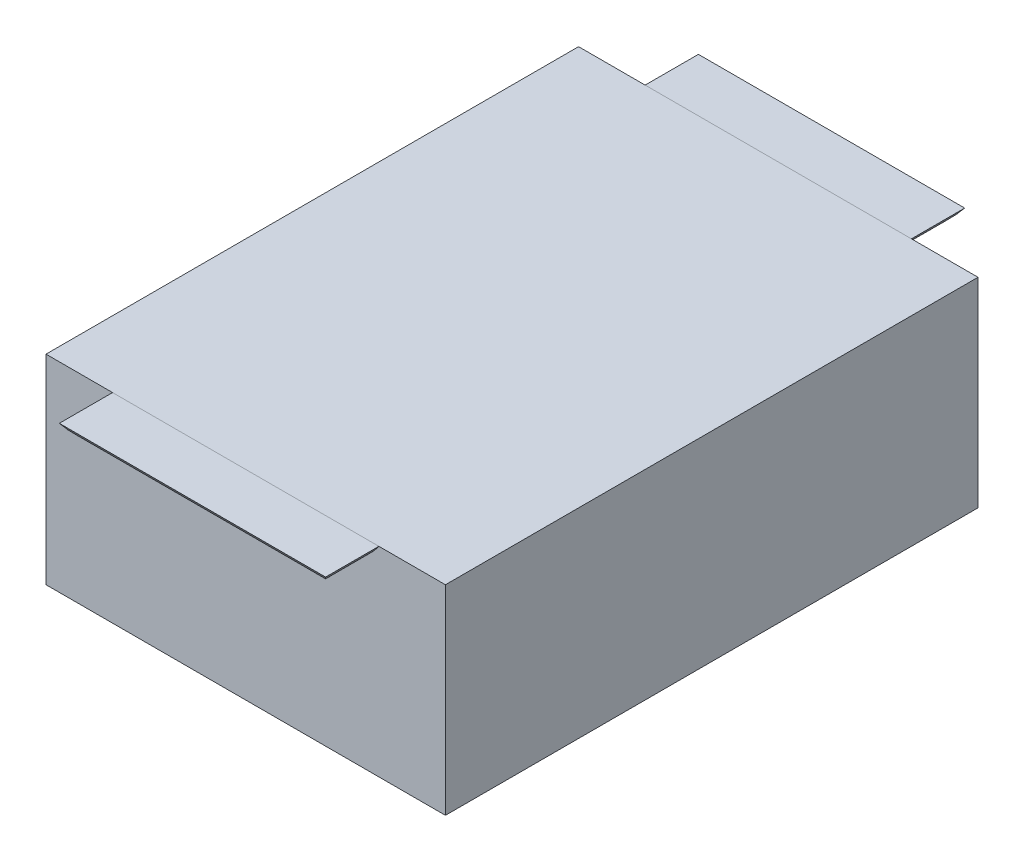
ISO-10303-21;
HEADER;
FILE_DESCRIPTION(('STEP AP214'),'2;1');
FILE_NAME('part.step','',(''),(''),'','','');
FILE_SCHEMA(('AUTOMOTIVE_DESIGN { 1 0 10303 214 1 1 1 1 }'));
ENDSEC;
DATA;
#1=APPLICATION_CONTEXT('core data for automotive mechanical design processes');
#2=APPLICATION_PROTOCOL_DEFINITION('international standard','automotive_design',2000,#1);
#3=PRODUCT_CONTEXT('',#1,'mechanical');
#4=PRODUCT('Part','Part','',(#3));
#5=PRODUCT_RELATED_PRODUCT_CATEGORY('part','',(#4));
#6=PRODUCT_DEFINITION_FORMATION('','',#4);
#7=PRODUCT_DEFINITION_CONTEXT('part definition',#1,'design');
#8=PRODUCT_DEFINITION('design','',#6,#7);
#9=PRODUCT_DEFINITION_SHAPE('','',#8);
#10=(LENGTH_UNIT() NAMED_UNIT(*) SI_UNIT(.MILLI.,.METRE.));
#11=(NAMED_UNIT(*) PLANE_ANGLE_UNIT() SI_UNIT($,.RADIAN.));
#12=(NAMED_UNIT(*) SI_UNIT($,.STERADIAN.) SOLID_ANGLE_UNIT());
#13=UNCERTAINTY_MEASURE_WITH_UNIT(LENGTH_MEASURE(1.E-05),#10,'distance_accuracy_value','');
#14=(GEOMETRIC_REPRESENTATION_CONTEXT(3) GLOBAL_UNCERTAINTY_ASSIGNED_CONTEXT((#13)) GLOBAL_UNIT_ASSIGNED_CONTEXT((#10,
#11,#12)) REPRESENTATION_CONTEXT('',''));
#15=CARTESIAN_POINT('',(0.,0.,0.));
#16=DIRECTION('',(0.,0.,1.));
#17=DIRECTION('',(1.,0.,0.));
#18=AXIS2_PLACEMENT_3D('',#15,#16,#17);
#19=CARTESIAN_POINT('',(21.85,0.,1.26033599464366));
#20=DIRECTION('',(0.,-1.,0.));
#21=DIRECTION('',(0.,0.,-1.));
#22=AXIS2_PLACEMENT_3D('',#19,#20,#21);
#23=PLANE('',#22);
#24=CARTESIAN_POINT('',(17.4533707275771,0.,-13.3793280107127));
#25=DIRECTION('',(0.,-1.,0.));
#26=DIRECTION('',(0.,0.,-1.));
#27=AXIS2_PLACEMENT_3D('',#24,#25,#26);
#28=CIRCLE('',#27,0.900000000000001);
#29=CARTESIAN_POINT('',(17.4533707275771,0.,-14.2793280107127));
#30=VERTEX_POINT('',#29);
#31=EDGE_CURVE('P0_E17',#30,#30,#28,.T.);
#32=ORIENTED_EDGE('',*,*,#31,.F.);
#33=EDGE_LOOP('',(#32));
#34=FACE_BOUND('',#33,.T.);
#35=ADVANCED_FACE('P0_F14',(#34),#23,.F.);
#36=CARTESIAN_POINT('',(17.4533707275771,0.,-13.3793280107127));
#37=DIRECTION('',(0.,-1.,0.));
#38=DIRECTION('',(0.,0.,-1.));
#39=AXIS2_PLACEMENT_3D('',#36,#37,#38);
#40=CYLINDRICAL_SURFACE('',#39,0.900000000000001);
#41=ORIENTED_EDGE('',*,*,#31,.T.);
#42=EDGE_LOOP('',(#41));
#43=FACE_BOUND('',#42,.T.);
#44=CARTESIAN_POINT('',(17.4533707275771,-0.2,-13.3793280107127));
#45=DIRECTION('',(0.,-1.,0.));
#46=DIRECTION('',(0.,0.,-1.));
#47=AXIS2_PLACEMENT_3D('',#44,#45,#46);
#48=CIRCLE('',#47,0.900000000000001);
#49=CARTESIAN_POINT('',(17.4533707275771,-0.2,-14.2793280107127));
#50=VERTEX_POINT('',#49);
#51=EDGE_CURVE('P0_E10',#50,#50,#48,.T.);
#52=ORIENTED_EDGE('',*,*,#51,.F.);
#53=EDGE_LOOP('',(#52));
#54=FACE_BOUND('',#53,.T.);
#55=ADVANCED_FACE('P0_F26',(#43,#54),#40,.T.);
#56=CARTESIAN_POINT('',(21.85,-0.2,1.26033599464366));
#57=DIRECTION('',(0.,-1.,0.));
#58=DIRECTION('',(0.,0.,-1.));
#59=AXIS2_PLACEMENT_3D('',#56,#57,#58);
#60=PLANE('',#59);
#61=ORIENTED_EDGE('',*,*,#51,.T.);
#62=EDGE_LOOP('',(#61));
#63=FACE_BOUND('',#62,.T.);
#64=ADVANCED_FACE('P0_F34',(#63),#60,.T.);
#65=CLOSED_SHELL('',(#35,#55,#64));
#66=MANIFOLD_SOLID_BREP('P0_B1',#65);
#67=CARTESIAN_POINT('',(17.4533707275771,1.3,-13.1793280107127));
#68=DIRECTION('',(0.,1.,0.));
#69=DIRECTION('',(0.,0.,1.));
#70=AXIS2_PLACEMENT_3D('',#67,#68,#69);
#71=PLANE('',#70);
#72=DIRECTION('',(-1.,0.,0.));
#73=VECTOR('',#72,1.);
#74=CARTESIAN_POINT('',(16.4533707275771,1.3,-11.3793280107127));
#75=LINE('',#74,#73);
#76=CARTESIAN_POINT('',(18.0792049888997,1.3,-11.3793280107127));
#77=VERTEX_POINT('',#76);
#78=CARTESIAN_POINT('',(16.8275364662545,1.3,-11.3793280107127));
#79=VERTEX_POINT('',#78);
#80=EDGE_CURVE('P1_E62',#77,#79,#75,.T.);
#81=ORIENTED_EDGE('',*,*,#80,.F.);
#82=DIRECTION('',(0.,0.,-1.));
#83=VECTOR('',#82,1.);
#84=CARTESIAN_POINT('',(18.0792049888997,1.3,-10.9793280107127));
#85=LINE('',#84,#83);
#86=CARTESIAN_POINT('',(18.0792049888997,1.3,-11.3534937493901));
#87=VERTEX_POINT('',#86);
#88=EDGE_CURVE('P1_E65',#87,#77,#85,.T.);
#89=ORIENTED_EDGE('',*,*,#88,.F.);
#90=DIRECTION('',(1.,0.,0.));
#91=VECTOR('',#90,1.);
#92=CARTESIAN_POINT('',(16.4533707275771,1.3,-11.3534937493901));
#93=LINE('',#92,#91);
#94=CARTESIAN_POINT('',(16.8275364662545,1.3,-11.3534937493901));
#95=VERTEX_POINT('',#94);
#96=EDGE_CURVE('P1_E74',#95,#87,#93,.T.);
#97=ORIENTED_EDGE('',*,*,#96,.F.);
#98=DIRECTION('',(0.,0.,1.));
#99=VECTOR('',#98,1.);
#100=CARTESIAN_POINT('',(16.8275364662545,1.3,-11.3793280107127));
#101=LINE('',#100,#99);
#102=EDGE_CURVE('P1_E66',#79,#95,#101,.T.);
#103=ORIENTED_EDGE('',*,*,#102,.F.);
#104=EDGE_LOOP('',(#81,#89,#97,#103));
#105=FACE_BOUND('',#104,.T.);
#106=ADVANCED_FACE('P1_F16',(#105),#71,.F.);
#107=CARTESIAN_POINT('',(16.4533707275771,1.5,-11.3793280107127));
#108=DIRECTION('',(0.,0.,-1.));
#109=DIRECTION('',(-1.,0.,0.));
#110=AXIS2_PLACEMENT_3D('',#107,#108,#109);
#111=PLANE('',#110);
#112=CARTESIAN_POINT('',(18.0792049888997,1.75,-11.3793280107127));
#113=DIRECTION('',(0.,0.,-1.));
#114=DIRECTION('',(-1.,0.,0.));
#115=AXIS2_PLACEMENT_3D('',#112,#113,#114);
#116=CIRCLE('',#115,0.449999999999999);
#117=CARTESIAN_POINT('',(18.4533707275771,1.5,-11.3793280107127));
#118=VERTEX_POINT('',#117);
#119=EDGE_CURVE('P1_E68',#77,#118,#116,.F.);
#120=ORIENTED_EDGE('',*,*,#119,.F.);
#121=ORIENTED_EDGE('',*,*,#80,.T.);
#122=CARTESIAN_POINT('',(16.8275364662545,1.75,-11.3793280107127));
#123=DIRECTION('',(0.,0.,1.));
#124=DIRECTION('',(1.,0.,0.));
#125=AXIS2_PLACEMENT_3D('',#122,#123,#124);
#126=CIRCLE('',#125,0.449999999999997);
#127=CARTESIAN_POINT('',(16.4533707275771,1.5,-11.3793280107127));
#128=VERTEX_POINT('',#127);
#129=EDGE_CURVE('P1_E19',#128,#79,#126,.T.);
#130=ORIENTED_EDGE('',*,*,#129,.F.);
#131=DIRECTION('',(1.,0.,0.));
#132=VECTOR('',#131,1.);
#133=CARTESIAN_POINT('',(17.4533707275771,1.5,-11.3793280107127));
#134=LINE('',#133,#132);
#135=EDGE_CURVE('P1_E56',#118,#128,#134,.F.);
#136=ORIENTED_EDGE('',*,*,#135,.F.);
#137=EDGE_LOOP('',(#120,#121,#130,#136));
#138=FACE_BOUND('',#137,.T.);
#139=ADVANCED_FACE('P1_F69',(#138),#111,.T.);
#140=CARTESIAN_POINT('',(16.8275364662545,1.75,-11.3793280107127));
#141=DIRECTION('',(0.,0.,1.));
#142=DIRECTION('',(1.,0.,0.));
#143=AXIS2_PLACEMENT_3D('',#140,#141,#142);
#144=CYLINDRICAL_SURFACE('',#143,0.449999999999997);
#145=CARTESIAN_POINT('',(16.8275364662545,1.75,-11.3534937493901));
#146=DIRECTION('',(0.707106781186547,0.,0.707106781186547));
#147=DIRECTION('',(0.707106781186547,0.,-0.707106781186547));
#148=AXIS2_PLACEMENT_3D('',#145,#146,#147);
#149=ELLIPSE('',#148,0.63639610306789,0.449999999999998);
#150=CARTESIAN_POINT('',(16.4533707275771,1.5,-10.9793280107127));
#151=VERTEX_POINT('',#150);
#152=EDGE_CURVE('P1_E82',#151,#95,#149,.T.);
#153=ORIENTED_EDGE('',*,*,#152,.F.);
#154=DIRECTION('',(0.,0.,1.));
#155=VECTOR('',#154,1.);
#156=CARTESIAN_POINT('',(16.4533707275771,1.5,-13.1793280107127));
#157=LINE('',#156,#155);
#158=EDGE_CURVE('P1_E78',#128,#151,#157,.T.);
#159=ORIENTED_EDGE('',*,*,#158,.F.);
#160=ORIENTED_EDGE('',*,*,#129,.T.);
#161=ORIENTED_EDGE('',*,*,#102,.T.);
#162=EDGE_LOOP('',(#153,#159,#160,#161));
#163=FACE_BOUND('',#162,.T.);
#164=ADVANCED_FACE('P1_F88',(#163),#144,.T.);
#165=CARTESIAN_POINT('',(16.4533707275771,1.75,-11.3534937493901));
#166=DIRECTION('',(1.,0.,0.));
#167=DIRECTION('',(0.,0.,-1.));
#168=AXIS2_PLACEMENT_3D('',#165,#166,#167);
#169=CYLINDRICAL_SURFACE('',#168,0.449999999999999);
#170=CARTESIAN_POINT('',(18.0792049888997,1.75,-11.3534937493901));
#171=DIRECTION('',(0.707106781186547,0.,-0.707106781186547));
#172=DIRECTION('',(-0.707106781186547,0.,-0.707106781186547));
#173=AXIS2_PLACEMENT_3D('',#170,#171,#172);
#174=ELLIPSE('',#173,0.636396103067891,0.449999999999999);
#175=CARTESIAN_POINT('',(18.4533707275771,1.5,-10.9793280107127));
#176=VERTEX_POINT('',#175);
#177=EDGE_CURVE('P1_E34',#176,#87,#174,.T.);
#178=ORIENTED_EDGE('',*,*,#177,.F.);
#179=DIRECTION('',(1.,0.,0.));
#180=VECTOR('',#179,1.);
#181=CARTESIAN_POINT('',(17.4533707275771,1.5,-10.9793280107127));
#182=LINE('',#181,#180);
#183=EDGE_CURVE('P1_E25',#151,#176,#182,.T.);
#184=ORIENTED_EDGE('',*,*,#183,.F.);
#185=ORIENTED_EDGE('',*,*,#152,.T.);
#186=ORIENTED_EDGE('',*,*,#96,.T.);
#187=EDGE_LOOP('',(#178,#184,#185,#186));
#188=FACE_BOUND('',#187,.T.);
#189=ADVANCED_FACE('P1_F86',(#188),#169,.T.);
#190=CARTESIAN_POINT('',(18.0792049888997,1.75,-10.9793280107127));
#191=DIRECTION('',(0.,0.,-1.));
#192=DIRECTION('',(-1.,0.,0.));
#193=AXIS2_PLACEMENT_3D('',#190,#191,#192);
#194=CYLINDRICAL_SURFACE('',#193,0.449999999999999);
#195=ORIENTED_EDGE('',*,*,#119,.T.);
#196=DIRECTION('',(0.,0.,1.));
#197=VECTOR('',#196,1.);
#198=CARTESIAN_POINT('',(18.4533707275771,1.5,-13.1793280107127));
#199=LINE('',#198,#197);
#200=EDGE_CURVE('P1_E11',#176,#118,#199,.F.);
#201=ORIENTED_EDGE('',*,*,#200,.F.);
#202=ORIENTED_EDGE('',*,*,#177,.T.);
#203=ORIENTED_EDGE('',*,*,#88,.T.);
#204=EDGE_LOOP('',(#195,#201,#202,#203));
#205=FACE_BOUND('',#204,.T.);
#206=ADVANCED_FACE('P1_F72',(#205),#194,.T.);
#207=CARTESIAN_POINT('',(17.4533707275771,1.5,-13.1793280107127));
#208=DIRECTION('',(0.,1.,0.));
#209=DIRECTION('',(0.,0.,1.));
#210=AXIS2_PLACEMENT_3D('',#207,#208,#209);
#211=PLANE('',#210);
#212=ORIENTED_EDGE('',*,*,#183,.T.);
#213=ORIENTED_EDGE('',*,*,#200,.T.);
#214=ORIENTED_EDGE('',*,*,#135,.T.);
#215=ORIENTED_EDGE('',*,*,#158,.T.);
#216=EDGE_LOOP('',(#212,#213,#214,#215));
#217=FACE_BOUND('',#216,.T.);
#218=ADVANCED_FACE('P1_F90',(#217),#211,.T.);
#219=CLOSED_SHELL('',(#106,#139,#164,#189,#206,#218));
#220=MANIFOLD_SOLID_BREP('P1_B1',#219);
#221=CARTESIAN_POINT('',(21.85,1.5,1.26033599464366));
#222=DIRECTION('',(0.,-1.,0.));
#223=DIRECTION('',(0.,0.,-1.));
#224=AXIS2_PLACEMENT_3D('',#221,#222,#223);
#225=PLANE('',#224);
#226=DIRECTION('',(1.,0.,0.));
#227=VECTOR('',#226,1.);
#228=CARTESIAN_POINT('',(15.9533707275771,1.5,-11.3793280107127));
#229=LINE('',#228,#227);
#230=CARTESIAN_POINT('',(18.9533707275771,1.5,-11.3793280107127));
#231=VERTEX_POINT('',#230);
#232=CARTESIAN_POINT('',(15.9533707275771,1.5,-11.3793280107127));
#233=VERTEX_POINT('',#232);
#234=EDGE_CURVE('P2_E79',#231,#233,#229,.F.);
#235=ORIENTED_EDGE('',*,*,#234,.F.);
#236=DIRECTION('',(0.,0.,-1.));
#237=VECTOR('',#236,1.);
#238=CARTESIAN_POINT('',(18.9533707275771,1.5,-11.3793280107127));
#239=LINE('',#238,#237);
#240=CARTESIAN_POINT('',(18.9533707275771,1.5,-15.3793280107127));
#241=VERTEX_POINT('',#240);
#242=EDGE_CURVE('P2_E67',#241,#231,#239,.F.);
#243=ORIENTED_EDGE('',*,*,#242,.F.);
#244=DIRECTION('',(-1.,0.,0.));
#245=VECTOR('',#244,1.);
#246=CARTESIAN_POINT('',(18.9533707275771,1.5,-15.3793280107127));
#247=LINE('',#246,#245);
#248=CARTESIAN_POINT('',(15.9533707275771,1.5,-15.3793280107127));
#249=VERTEX_POINT('',#248);
#250=EDGE_CURVE('P2_E54',#249,#241,#247,.F.);
#251=ORIENTED_EDGE('',*,*,#250,.F.);
#252=DIRECTION('',(0.,0.,1.));
#253=VECTOR('',#252,1.);
#254=CARTESIAN_POINT('',(15.9533707275771,1.5,-15.3793280107127));
#255=LINE('',#254,#253);
#256=EDGE_CURVE('P2_E19',#233,#249,#255,.F.);
#257=ORIENTED_EDGE('',*,*,#256,.F.);
#258=EDGE_LOOP('',(#235,#243,#251,#257));
#259=FACE_BOUND('',#258,.T.);
#260=ADVANCED_FACE('P2_F16',(#259),#225,.F.);
#261=CARTESIAN_POINT('',(15.9533707275771,0.,-15.3793280107127));
#262=DIRECTION('',(-1.,0.,0.));
#263=DIRECTION('',(0.,0.,1.));
#264=AXIS2_PLACEMENT_3D('',#261,#262,#263);
#265=PLANE('',#264);
#266=ORIENTED_EDGE('',*,*,#256,.T.);
#267=DIRECTION('',(0.,1.,0.));
#268=VECTOR('',#267,1.);
#269=CARTESIAN_POINT('',(15.9533707275771,0.,-15.3793280107127));
#270=LINE('',#269,#268);
#271=CARTESIAN_POINT('',(15.9533707275771,0.,-15.3793280107127));
#272=VERTEX_POINT('',#271);
#273=EDGE_CURVE('P2_E60',#272,#249,#270,.T.);
#274=ORIENTED_EDGE('',*,*,#273,.F.);
#275=DIRECTION('',(0.,0.,-1.));
#276=VECTOR('',#275,1.);
#277=CARTESIAN_POINT('',(15.9533707275771,0.,1.26033599464366));
#278=LINE('',#277,#276);
#279=CARTESIAN_POINT('',(15.9533707275771,0.,-11.3793280107127));
#280=VERTEX_POINT('',#279);
#281=EDGE_CURVE('P2_E82',#280,#272,#278,.T.);
#282=ORIENTED_EDGE('',*,*,#281,.F.);
#283=DIRECTION('',(0.,1.,0.));
#284=VECTOR('',#283,1.);
#285=CARTESIAN_POINT('',(15.9533707275771,0.,-11.3793280107127));
#286=LINE('',#285,#284);
#287=EDGE_CURVE('P2_E63',#233,#280,#286,.F.);
#288=ORIENTED_EDGE('',*,*,#287,.F.);
#289=EDGE_LOOP('',(#266,#274,#282,#288));
#290=FACE_BOUND('',#289,.T.);
#291=ADVANCED_FACE('P2_F59',(#290),#265,.T.);
#292=CARTESIAN_POINT('',(18.9533707275771,0.,-15.3793280107127));
#293=DIRECTION('',(0.,0.,-1.));
#294=DIRECTION('',(-1.,0.,0.));
#295=AXIS2_PLACEMENT_3D('',#292,#293,#294);
#296=PLANE('',#295);
#297=ORIENTED_EDGE('',*,*,#250,.T.);
#298=DIRECTION('',(0.,1.,0.));
#299=VECTOR('',#298,1.);
#300=CARTESIAN_POINT('',(18.9533707275771,0.,-15.3793280107127));
#301=LINE('',#300,#299);
#302=CARTESIAN_POINT('',(18.9533707275771,0.,-15.3793280107127));
#303=VERTEX_POINT('',#302);
#304=EDGE_CURVE('P2_E69',#303,#241,#301,.T.);
#305=ORIENTED_EDGE('',*,*,#304,.F.);
#306=DIRECTION('',(1.,0.,0.));
#307=VECTOR('',#306,1.);
#308=CARTESIAN_POINT('',(21.85,0.,-15.3793280107127));
#309=LINE('',#308,#307);
#310=EDGE_CURVE('P2_E73',#272,#303,#309,.T.);
#311=ORIENTED_EDGE('',*,*,#310,.F.);
#312=ORIENTED_EDGE('',*,*,#273,.T.);
#313=EDGE_LOOP('',(#297,#305,#311,#312));
#314=FACE_BOUND('',#313,.T.);
#315=ADVANCED_FACE('P2_F71',(#314),#296,.T.);
#316=CARTESIAN_POINT('',(18.9533707275771,0.,-11.3793280107127));
#317=DIRECTION('',(1.,0.,0.));
#318=DIRECTION('',(0.,0.,-1.));
#319=AXIS2_PLACEMENT_3D('',#316,#317,#318);
#320=PLANE('',#319);
#321=ORIENTED_EDGE('',*,*,#242,.T.);
#322=DIRECTION('',(0.,1.,0.));
#323=VECTOR('',#322,1.);
#324=CARTESIAN_POINT('',(18.9533707275771,0.,-11.3793280107127));
#325=LINE('',#324,#323);
#326=CARTESIAN_POINT('',(18.9533707275771,0.,-11.3793280107127));
#327=VERTEX_POINT('',#326);
#328=EDGE_CURVE('P2_E34',#327,#231,#325,.T.);
#329=ORIENTED_EDGE('',*,*,#328,.F.);
#330=DIRECTION('',(0.,0.,-1.));
#331=VECTOR('',#330,1.);
#332=CARTESIAN_POINT('',(18.9533707275771,0.,1.26033599464366));
#333=LINE('',#332,#331);
#334=EDGE_CURVE('P2_E25',#303,#327,#333,.F.);
#335=ORIENTED_EDGE('',*,*,#334,.F.);
#336=ORIENTED_EDGE('',*,*,#304,.T.);
#337=EDGE_LOOP('',(#321,#329,#335,#336));
#338=FACE_BOUND('',#337,.T.);
#339=ADVANCED_FACE('P2_F88',(#338),#320,.T.);
#340=CARTESIAN_POINT('',(15.9533707275771,0.,-11.3793280107127));
#341=DIRECTION('',(0.,0.,1.));
#342=DIRECTION('',(1.,0.,0.));
#343=AXIS2_PLACEMENT_3D('',#340,#341,#342);
#344=PLANE('',#343);
#345=ORIENTED_EDGE('',*,*,#234,.T.);
#346=ORIENTED_EDGE('',*,*,#287,.T.);
#347=DIRECTION('',(1.,0.,0.));
#348=VECTOR('',#347,1.);
#349=CARTESIAN_POINT('',(21.85,0.,-11.3793280107127));
#350=LINE('',#349,#348);
#351=EDGE_CURVE('P2_E11',#327,#280,#350,.F.);
#352=ORIENTED_EDGE('',*,*,#351,.F.);
#353=ORIENTED_EDGE('',*,*,#328,.T.);
#354=EDGE_LOOP('',(#345,#346,#352,#353));
#355=FACE_BOUND('',#354,.T.);
#356=ADVANCED_FACE('P2_F90',(#355),#344,.T.);
#357=CARTESIAN_POINT('',(21.85,0.,1.26033599464366));
#358=DIRECTION('',(0.,-1.,0.));
#359=DIRECTION('',(0.,0.,-1.));
#360=AXIS2_PLACEMENT_3D('',#357,#358,#359);
#361=PLANE('',#360);
#362=ORIENTED_EDGE('',*,*,#334,.T.);
#363=ORIENTED_EDGE('',*,*,#351,.T.);
#364=ORIENTED_EDGE('',*,*,#281,.T.);
#365=ORIENTED_EDGE('',*,*,#310,.T.);
#366=EDGE_LOOP('',(#362,#363,#364,#365));
#367=FACE_BOUND('',#366,.T.);
#368=ADVANCED_FACE('P2_F87',(#367),#361,.T.);
#369=CLOSED_SHELL('',(#260,#291,#315,#339,#356,#368));
#370=MANIFOLD_SOLID_BREP('P2_B1',#369);
#371=CARTESIAN_POINT('',(17.4533707275771,1.3,-13.5793280107127));
#372=DIRECTION('',(0.,-1.,0.));
#373=DIRECTION('',(0.,0.,-1.));
#374=AXIS2_PLACEMENT_3D('',#371,#372,#373);
#375=PLANE('',#374);
#376=DIRECTION('',(0.,0.,-1.));
#377=VECTOR('',#376,1.);
#378=CARTESIAN_POINT('',(18.0792049888997,1.3,-15.7793280107127));
#379=LINE('',#378,#377);
#380=CARTESIAN_POINT('',(18.0792049888997,1.3,-15.3793280107127));
#381=VERTEX_POINT('',#380);
#382=CARTESIAN_POINT('',(18.0792049888997,1.3,-15.4051622720353));
#383=VERTEX_POINT('',#382);
#384=EDGE_CURVE('P3_E82',#381,#383,#379,.T.);
#385=ORIENTED_EDGE('',*,*,#384,.F.);
#386=DIRECTION('',(-1.,0.,0.));
#387=VECTOR('',#386,1.);
#388=CARTESIAN_POINT('',(16.4533707275771,1.3,-15.3793280107127));
#389=LINE('',#388,#387);
#390=CARTESIAN_POINT('',(16.8275364662545,1.3,-15.3793280107127));
#391=VERTEX_POINT('',#390);
#392=EDGE_CURVE('P3_E56',#381,#391,#389,.T.);
#393=ORIENTED_EDGE('',*,*,#392,.T.);
#394=DIRECTION('',(0.,0.,1.));
#395=VECTOR('',#394,1.);
#396=CARTESIAN_POINT('',(16.8275364662545,1.3,-15.3793280107127));
#397=LINE('',#396,#395);
#398=CARTESIAN_POINT('',(16.8275364662545,1.3,-15.4051622720353));
#399=VERTEX_POINT('',#398);
#400=EDGE_CURVE('P3_E52',#399,#391,#397,.T.);
#401=ORIENTED_EDGE('',*,*,#400,.F.);
#402=DIRECTION('',(-1.,0.,0.));
#403=VECTOR('',#402,1.);
#404=CARTESIAN_POINT('',(16.4533707275771,1.3,-15.4051622720353));
#405=LINE('',#404,#403);
#406=EDGE_CURVE('P3_E54',#383,#399,#405,.T.);
#407=ORIENTED_EDGE('',*,*,#406,.F.);
#408=EDGE_LOOP('',(#385,#393,#401,#407));
#409=FACE_BOUND('',#408,.T.);
#410=ADVANCED_FACE('P3_F16',(#409),#375,.T.);
#411=CARTESIAN_POINT('',(16.8275364662545,1.75,-15.3793280107127));
#412=DIRECTION('',(0.,0.,1.));
#413=DIRECTION('',(1.,0.,0.));
#414=AXIS2_PLACEMENT_3D('',#411,#412,#413);
#415=CYLINDRICAL_SURFACE('',#414,0.449999999999997);
#416=CARTESIAN_POINT('',(16.8275364662545,1.75,-15.4051622720353));
#417=DIRECTION('',(-0.707106781186547,0.,0.707106781186547));
#418=DIRECTION('',(-0.707106781186547,0.,-0.707106781186547));
#419=AXIS2_PLACEMENT_3D('',#416,#417,#418);
#420=ELLIPSE('',#419,0.63639610306789,0.449999999999998);
#421=CARTESIAN_POINT('',(16.4533707275771,1.5,-15.7793280107127));
#422=VERTEX_POINT('',#421);
#423=EDGE_CURVE('P3_E19',#399,#422,#420,.F.);
#424=ORIENTED_EDGE('',*,*,#423,.F.);
#425=ORIENTED_EDGE('',*,*,#400,.T.);
#426=CARTESIAN_POINT('',(16.8275364662545,1.75,-15.3793280107127));
#427=DIRECTION('',(0.,0.,1.));
#428=DIRECTION('',(1.,0.,0.));
#429=AXIS2_PLACEMENT_3D('',#426,#427,#428);
#430=CIRCLE('',#429,0.449999999999997);
#431=CARTESIAN_POINT('',(16.4533707275771,1.5,-15.3793280107127));
#432=VERTEX_POINT('',#431);
#433=EDGE_CURVE('P3_E74',#391,#432,#430,.F.);
#434=ORIENTED_EDGE('',*,*,#433,.T.);
#435=DIRECTION('',(0.,0.,-1.));
#436=VECTOR('',#435,1.);
#437=CARTESIAN_POINT('',(16.4533707275771,1.5,-13.5793280107127));
#438=LINE('',#437,#436);
#439=EDGE_CURVE('P3_E73',#432,#422,#438,.T.);
#440=ORIENTED_EDGE('',*,*,#439,.T.);
#441=EDGE_LOOP('',(#424,#425,#434,#440));
#442=FACE_BOUND('',#441,.T.);
#443=ADVANCED_FACE('P3_F71',(#442),#415,.T.);
#444=CARTESIAN_POINT('',(16.4533707275771,1.75,-15.4051622720353));
#445=DIRECTION('',(-1.,0.,0.));
#446=DIRECTION('',(0.,0.,1.));
#447=AXIS2_PLACEMENT_3D('',#444,#445,#446);
#448=CYLINDRICAL_SURFACE('',#447,0.449999999999999);
#449=CARTESIAN_POINT('',(18.0792049888997,1.75,-15.4051622720353));
#450=DIRECTION('',(-0.707106781186547,0.,-0.707106781186547));
#451=DIRECTION('',(0.707106781186547,0.,-0.707106781186547));
#452=AXIS2_PLACEMENT_3D('',#449,#450,#451);
#453=ELLIPSE('',#452,0.636396103067891,0.449999999999999);
#454=CARTESIAN_POINT('',(18.4533707275771,1.5,-15.7793280107127));
#455=VERTEX_POINT('',#454);
#456=EDGE_CURVE('P3_E68',#383,#455,#453,.F.);
#457=ORIENTED_EDGE('',*,*,#456,.F.);
#458=ORIENTED_EDGE('',*,*,#406,.T.);
#459=ORIENTED_EDGE('',*,*,#423,.T.);
#460=DIRECTION('',(1.,0.,0.));
#461=VECTOR('',#460,1.);
#462=CARTESIAN_POINT('',(17.4533707275771,1.5,-15.7793280107127));
#463=LINE('',#462,#461);
#464=EDGE_CURVE('P3_E76',#422,#455,#463,.T.);
#465=ORIENTED_EDGE('',*,*,#464,.T.);
#466=EDGE_LOOP('',(#457,#458,#459,#465));
#467=FACE_BOUND('',#466,.T.);
#468=ADVANCED_FACE('P3_F65',(#467),#448,.T.);
#469=CARTESIAN_POINT('',(18.0792049888997,1.75,-15.7793280107127));
#470=DIRECTION('',(0.,0.,-1.));
#471=DIRECTION('',(-1.,0.,0.));
#472=AXIS2_PLACEMENT_3D('',#469,#470,#471);
#473=CYLINDRICAL_SURFACE('',#472,0.449999999999999);
#474=CARTESIAN_POINT('',(18.0792049888997,1.75,-15.3793280107127));
#475=DIRECTION('',(0.,0.,-1.));
#476=DIRECTION('',(-1.,0.,0.));
#477=AXIS2_PLACEMENT_3D('',#474,#475,#476);
#478=CIRCLE('',#477,0.449999999999999);
#479=CARTESIAN_POINT('',(18.4533707275771,1.5,-15.3793280107127));
#480=VERTEX_POINT('',#479);
#481=EDGE_CURVE('P3_E33',#480,#381,#478,.T.);
#482=ORIENTED_EDGE('',*,*,#481,.T.);
#483=ORIENTED_EDGE('',*,*,#384,.T.);
#484=ORIENTED_EDGE('',*,*,#456,.T.);
#485=DIRECTION('',(0.,0.,-1.));
#486=VECTOR('',#485,1.);
#487=CARTESIAN_POINT('',(18.4533707275771,1.5,-13.5793280107127));
#488=LINE('',#487,#486);
#489=EDGE_CURVE('P3_E25',#455,#480,#488,.F.);
#490=ORIENTED_EDGE('',*,*,#489,.T.);
#491=EDGE_LOOP('',(#482,#483,#484,#490));
#492=FACE_BOUND('',#491,.T.);
#493=ADVANCED_FACE('P3_F87',(#492),#473,.T.);
#494=CARTESIAN_POINT('',(16.4533707275771,1.5,-15.3793280107127));
#495=DIRECTION('',(0.,0.,-1.));
#496=DIRECTION('',(-1.,0.,0.));
#497=AXIS2_PLACEMENT_3D('',#494,#495,#496);
#498=PLANE('',#497);
#499=ORIENTED_EDGE('',*,*,#392,.F.);
#500=ORIENTED_EDGE('',*,*,#481,.F.);
#501=DIRECTION('',(1.,0.,0.));
#502=VECTOR('',#501,1.);
#503=CARTESIAN_POINT('',(17.4533707275771,1.5,-15.3793280107127));
#504=LINE('',#503,#502);
#505=EDGE_CURVE('P3_E11',#480,#432,#504,.F.);
#506=ORIENTED_EDGE('',*,*,#505,.T.);
#507=ORIENTED_EDGE('',*,*,#433,.F.);
#508=EDGE_LOOP('',(#499,#500,#506,#507));
#509=FACE_BOUND('',#508,.T.);
#510=ADVANCED_FACE('P3_F90',(#509),#498,.F.);
#511=CARTESIAN_POINT('',(17.4533707275771,1.5,-13.5793280107127));
#512=DIRECTION('',(0.,-1.,0.));
#513=DIRECTION('',(0.,0.,-1.));
#514=AXIS2_PLACEMENT_3D('',#511,#512,#513);
#515=PLANE('',#514);
#516=ORIENTED_EDGE('',*,*,#489,.F.);
#517=ORIENTED_EDGE('',*,*,#464,.F.);
#518=ORIENTED_EDGE('',*,*,#439,.F.);
#519=ORIENTED_EDGE('',*,*,#505,.F.);
#520=EDGE_LOOP('',(#516,#517,#518,#519));
#521=FACE_BOUND('',#520,.T.);
#522=ADVANCED_FACE('P3_F88',(#521),#515,.F.);
#523=CLOSED_SHELL('',(#410,#443,#468,#493,#510,#522));
#524=MANIFOLD_SOLID_BREP('P3_B1',#523);
#525=ADVANCED_BREP_SHAPE_REPRESENTATION('',(#18,#66,#220,#370,#524),#14);
#526=SHAPE_DEFINITION_REPRESENTATION(#9,#525);
ENDSEC;
END-ISO-10303-21;
